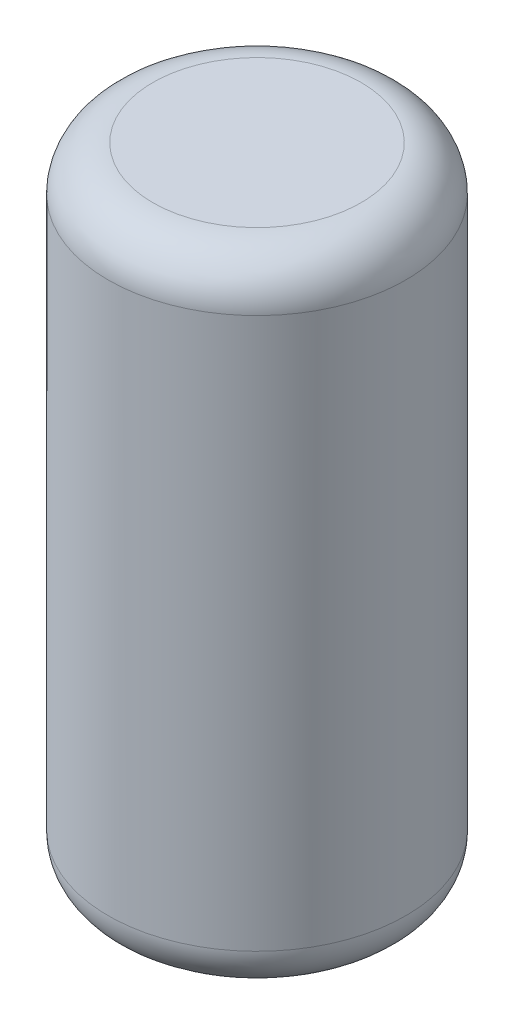
ISO-10303-21;
HEADER;
FILE_DESCRIPTION(('STEP AP214'),'2;1');
FILE_NAME('part.step','',(''),(''),'','','');
FILE_SCHEMA(('AUTOMOTIVE_DESIGN { 1 0 10303 214 1 1 1 1 }'));
ENDSEC;
DATA;
#1=APPLICATION_CONTEXT('core data for automotive mechanical design processes');
#2=APPLICATION_PROTOCOL_DEFINITION('international standard','automotive_design',2000,#1);
#3=PRODUCT_CONTEXT('',#1,'mechanical');
#4=PRODUCT('Part','Part','',(#3));
#5=PRODUCT_RELATED_PRODUCT_CATEGORY('part','',(#4));
#6=PRODUCT_DEFINITION_FORMATION('','',#4);
#7=PRODUCT_DEFINITION_CONTEXT('part definition',#1,'design');
#8=PRODUCT_DEFINITION('design','',#6,#7);
#9=PRODUCT_DEFINITION_SHAPE('','',#8);
#10=(LENGTH_UNIT() NAMED_UNIT(*) SI_UNIT(.MILLI.,.METRE.));
#11=(NAMED_UNIT(*) PLANE_ANGLE_UNIT() SI_UNIT($,.RADIAN.));
#12=(NAMED_UNIT(*) SI_UNIT($,.STERADIAN.) SOLID_ANGLE_UNIT());
#13=UNCERTAINTY_MEASURE_WITH_UNIT(LENGTH_MEASURE(1.E-05),#10,'distance_accuracy_value','');
#14=(GEOMETRIC_REPRESENTATION_CONTEXT(3) GLOBAL_UNCERTAINTY_ASSIGNED_CONTEXT((#13)) GLOBAL_UNIT_ASSIGNED_CONTEXT((#10,
#11,#12)) REPRESENTATION_CONTEXT('',''));
#15=CARTESIAN_POINT('',(0.,0.,0.));
#16=DIRECTION('',(0.,0.,1.));
#17=DIRECTION('',(1.,0.,0.));
#18=AXIS2_PLACEMENT_3D('',#15,#16,#17);
#19=CARTESIAN_POINT('',(0.,215.,0.));
#20=DIRECTION('',(0.,1.,0.));
#21=DIRECTION('',(0.,0.,1.));
#22=AXIS2_PLACEMENT_3D('',#19,#20,#21);
#23=PLANE('',#22);
#24=CARTESIAN_POINT('',(0.,215.,0.));
#25=DIRECTION('',(0.,1.,0.));
#26=DIRECTION('',(0.,0.,1.));
#27=AXIS2_PLACEMENT_3D('',#24,#25,#26);
#28=CIRCLE('',#27,35.);
#29=CARTESIAN_POINT('',(0.,215.,35.));
#30=VERTEX_POINT('',#29);
#31=EDGE_CURVE('E10',#30,#30,#28,.T.);
#32=ORIENTED_EDGE('',*,*,#31,.T.);
#33=EDGE_LOOP('',(#32));
#34=FACE_BOUND('',#33,.T.);
#35=ADVANCED_FACE('F34',(#34),#23,.T.);
#36=CARTESIAN_POINT('',(0.,0.,0.));
#37=DIRECTION('',(0.,-1.,0.));
#38=DIRECTION('',(0.,0.,-1.));
#39=AXIS2_PLACEMENT_3D('',#36,#37,#38);
#40=CYLINDRICAL_SURFACE('',#39,50.);
#41=CARTESIAN_POINT('',(0.,15.,0.));
#42=DIRECTION('',(0.,-1.,0.));
#43=DIRECTION('',(0.,0.,-1.));
#44=AXIS2_PLACEMENT_3D('',#41,#42,#43);
#45=CIRCLE('',#44,50.);
#46=CARTESIAN_POINT('',(0.,15.,-50.));
#47=VERTEX_POINT('',#46);
#48=EDGE_CURVE('E41',#47,#47,#45,.F.);
#49=ORIENTED_EDGE('',*,*,#48,.T.);
#50=EDGE_LOOP('',(#49));
#51=FACE_BOUND('',#50,.T.);
#52=CARTESIAN_POINT('',(0.,200.,0.));
#53=DIRECTION('',(0.,1.,0.));
#54=DIRECTION('',(0.,0.,1.));
#55=AXIS2_PLACEMENT_3D('',#52,#53,#54);
#56=CIRCLE('',#55,50.);
#57=CARTESIAN_POINT('',(0.,200.,50.));
#58=VERTEX_POINT('',#57);
#59=EDGE_CURVE('E45',#58,#58,#56,.F.);
#60=ORIENTED_EDGE('',*,*,#59,.T.);
#61=EDGE_LOOP('',(#60));
#62=FACE_BOUND('',#61,.T.);
#63=ADVANCED_FACE('F65',(#51,#62),#40,.T.);
#64=CARTESIAN_POINT('',(0.,0.,0.));
#65=DIRECTION('',(0.,-1.,0.));
#66=DIRECTION('',(0.,0.,-1.));
#67=AXIS2_PLACEMENT_3D('',#64,#65,#66);
#68=PLANE('',#67);
#69=CARTESIAN_POINT('',(0.,0.,0.));
#70=DIRECTION('',(0.,-1.,0.));
#71=DIRECTION('',(0.,0.,-1.));
#72=AXIS2_PLACEMENT_3D('',#69,#70,#71);
#73=CIRCLE('',#72,35.);
#74=CARTESIAN_POINT('',(0.,0.,-35.));
#75=VERTEX_POINT('',#74);
#76=EDGE_CURVE('E49',#75,#75,#73,.T.);
#77=ORIENTED_EDGE('',*,*,#76,.T.);
#78=EDGE_LOOP('',(#77));
#79=FACE_BOUND('',#78,.T.);
#80=ADVANCED_FACE('F55',(#79),#68,.T.);
#81=CARTESIAN_POINT('',(0.,15.,0.));
#82=DIRECTION('',(0.,-1.,0.));
#83=DIRECTION('',(0.,0.,-1.));
#84=AXIS2_PLACEMENT_3D('',#81,#82,#83);
#85=TOROIDAL_SURFACE('',#84,35.,15.);
#86=ORIENTED_EDGE('',*,*,#48,.F.);
#87=EDGE_LOOP('',(#86));
#88=FACE_BOUND('',#87,.T.);
#89=ORIENTED_EDGE('',*,*,#76,.F.);
#90=EDGE_LOOP('',(#89));
#91=FACE_BOUND('',#90,.T.);
#92=ADVANCED_FACE('F57',(#88,#91),#85,.T.);
#93=CARTESIAN_POINT('',(0.,200.,0.));
#94=DIRECTION('',(0.,1.,0.));
#95=DIRECTION('',(0.,0.,1.));
#96=AXIS2_PLACEMENT_3D('',#93,#94,#95);
#97=TOROIDAL_SURFACE('',#96,35.,15.);
#98=ORIENTED_EDGE('',*,*,#31,.F.);
#99=EDGE_LOOP('',(#98));
#100=FACE_BOUND('',#99,.T.);
#101=ORIENTED_EDGE('',*,*,#59,.F.);
#102=EDGE_LOOP('',(#101));
#103=FACE_BOUND('',#102,.T.);
#104=ADVANCED_FACE('F36',(#100,#103),#97,.T.);
#105=CLOSED_SHELL('',(#35,#63,#80,#92,#104));
#106=MANIFOLD_SOLID_BREP('B2',#105);
#107=ADVANCED_BREP_SHAPE_REPRESENTATION('',(#18,#106),#14);
#108=SHAPE_DEFINITION_REPRESENTATION(#9,#107);
ENDSEC;
END-ISO-10303-21;
